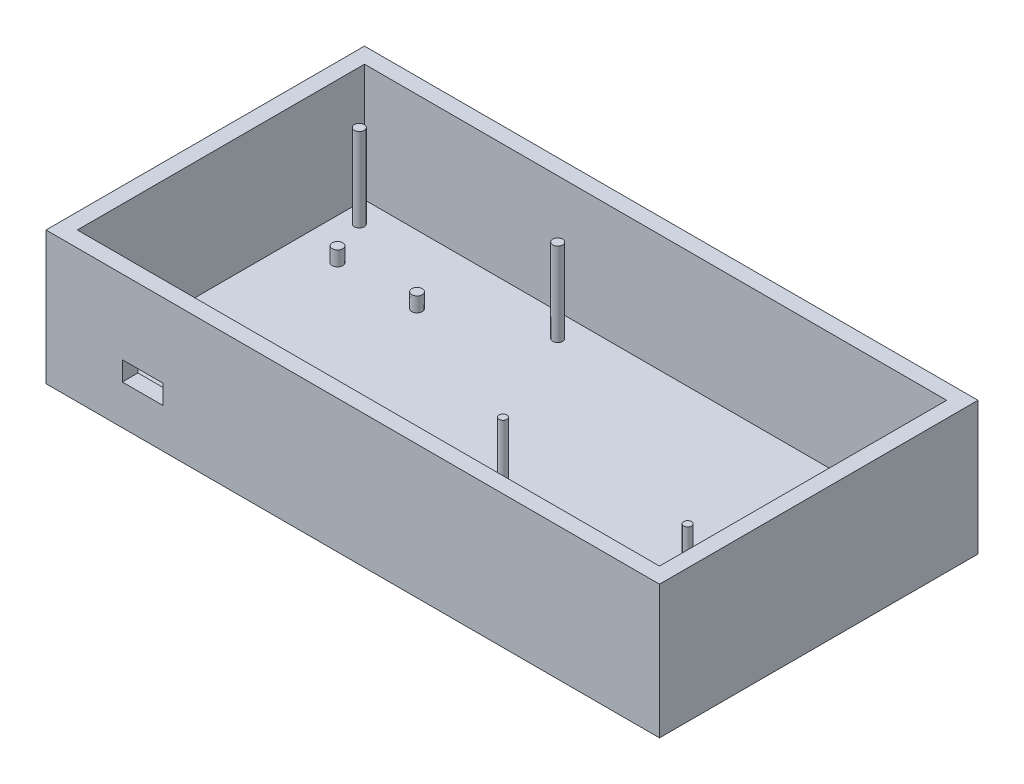
ISO-10303-21;
HEADER;
FILE_DESCRIPTION(('STEP AP214'),'2;1');
FILE_NAME('part.step','',(''),(''),'','','');
FILE_SCHEMA(('AUTOMOTIVE_DESIGN { 1 0 10303 214 1 1 1 1 }'));
ENDSEC;
DATA;
#1=APPLICATION_CONTEXT('core data for automotive mechanical design processes');
#2=APPLICATION_PROTOCOL_DEFINITION('international standard','automotive_design',2000,#1);
#3=PRODUCT_CONTEXT('',#1,'mechanical');
#4=PRODUCT('Part','Part','',(#3));
#5=PRODUCT_RELATED_PRODUCT_CATEGORY('part','',(#4));
#6=PRODUCT_DEFINITION_FORMATION('','',#4);
#7=PRODUCT_DEFINITION_CONTEXT('part definition',#1,'design');
#8=PRODUCT_DEFINITION('design','',#6,#7);
#9=PRODUCT_DEFINITION_SHAPE('','',#8);
#10=(LENGTH_UNIT() NAMED_UNIT(*) SI_UNIT(.MILLI.,.METRE.));
#11=(NAMED_UNIT(*) PLANE_ANGLE_UNIT() SI_UNIT($,.RADIAN.));
#12=(NAMED_UNIT(*) SI_UNIT($,.STERADIAN.) SOLID_ANGLE_UNIT());
#13=UNCERTAINTY_MEASURE_WITH_UNIT(LENGTH_MEASURE(1.E-05),#10,'distance_accuracy_value','');
#14=(GEOMETRIC_REPRESENTATION_CONTEXT(3) GLOBAL_UNCERTAINTY_ASSIGNED_CONTEXT((#13)) GLOBAL_UNIT_ASSIGNED_CONTEXT((#10,
#11,#12)) REPRESENTATION_CONTEXT('',''));
#15=CARTESIAN_POINT('',(0.,0.,0.));
#16=DIRECTION('',(0.,0.,1.));
#17=DIRECTION('',(1.,0.,0.));
#18=AXIS2_PLACEMENT_3D('',#15,#16,#17);
#19=CARTESIAN_POINT('',(-95.3573667152062,22.5,-48.2847726085003));
#20=DIRECTION('',(1.,0.,0.));
#21=DIRECTION('',(0.,0.,-1.));
#22=AXIS2_PLACEMENT_3D('',#19,#20,#21);
#23=PLANE('',#22);
#24=DIRECTION('',(0.,0.,1.));
#25=VECTOR('',#24,1.);
#26=CARTESIAN_POINT('',(-95.3573667152062,-3.,-48.2847726085003));
#27=LINE('',#26,#25);
#28=CARTESIAN_POINT('',(-95.3573667152062,-3.,-51.2847726085003));
#29=VERTEX_POINT('',#28);
#30=CARTESIAN_POINT('',(-95.3573667152062,-3.,9.71522739149973));
#31=VERTEX_POINT('',#30);
#32=EDGE_CURVE('E204',#29,#31,#27,.T.);
#33=ORIENTED_EDGE('',*,*,#32,.T.);
#34=DIRECTION('',(0.,-1.,0.));
#35=VECTOR('',#34,1.);
#36=CARTESIAN_POINT('',(-95.3573667152062,22.5,9.71522739149973));
#37=LINE('',#36,#35);
#38=CARTESIAN_POINT('',(-95.3573667152062,22.5,9.71522739149973));
#39=VERTEX_POINT('',#38);
#40=EDGE_CURVE('E208',#39,#31,#37,.T.);
#41=ORIENTED_EDGE('',*,*,#40,.F.);
#42=DIRECTION('',(0.,0.,1.));
#43=VECTOR('',#42,1.);
#44=CARTESIAN_POINT('',(-95.3573667152062,22.5,-48.2847726085003));
#45=LINE('',#44,#43);
#46=CARTESIAN_POINT('',(-95.3573667152062,22.5,-51.2847726085003));
#47=VERTEX_POINT('',#46);
#48=EDGE_CURVE('E227',#47,#39,#45,.T.);
#49=ORIENTED_EDGE('',*,*,#48,.F.);
#50=DIRECTION('',(0.,-1.,0.));
#51=VECTOR('',#50,1.);
#52=CARTESIAN_POINT('',(-95.3573667152062,22.5,-51.2847726085003));
#53=LINE('',#52,#51);
#54=EDGE_CURVE('E213',#47,#29,#53,.T.);
#55=ORIENTED_EDGE('',*,*,#54,.T.);
#56=EDGE_LOOP('',(#33,#41,#49,#55));
#57=FACE_BOUND('',#56,.T.);
#58=ADVANCED_FACE('F34',(#57),#23,.F.);
#59=CARTESIAN_POINT('',(-92.3573667152062,22.5,9.71522739149973));
#60=DIRECTION('',(0.,0.,-1.));
#61=DIRECTION('',(-1.,0.,0.));
#62=AXIS2_PLACEMENT_3D('',#59,#60,#61);
#63=PLANE('',#62);
#64=DIRECTION('',(1.,0.,0.));
#65=VECTOR('',#64,1.);
#66=CARTESIAN_POINT('',(-80.7473667152062,4.59,9.71522739149973));
#67=LINE('',#66,#65);
#68=CARTESIAN_POINT('',(-80.7473667152062,4.59,9.71522739149973));
#69=VERTEX_POINT('',#68);
#70=CARTESIAN_POINT('',(-72.9473667152062,4.59,9.71522739149973));
#71=VERTEX_POINT('',#70);
#72=EDGE_CURVE('E134',#69,#71,#67,.T.);
#73=ORIENTED_EDGE('',*,*,#72,.F.);
#74=DIRECTION('',(0.,-1.,0.));
#75=VECTOR('',#74,1.);
#76=CARTESIAN_POINT('',(-80.7473667152062,8.29,9.71522739149973));
#77=LINE('',#76,#75);
#78=CARTESIAN_POINT('',(-80.7473667152062,8.29,9.71522739149973));
#79=VERTEX_POINT('',#78);
#80=EDGE_CURVE('E49',#79,#69,#77,.T.);
#81=ORIENTED_EDGE('',*,*,#80,.F.);
#82=DIRECTION('',(-1.,0.,0.));
#83=VECTOR('',#82,1.);
#84=CARTESIAN_POINT('',(-80.7473667152062,8.29,9.71522739149973));
#85=LINE('',#84,#83);
#86=CARTESIAN_POINT('',(-72.9473667152062,8.29,9.71522739149973));
#87=VERTEX_POINT('',#86);
#88=EDGE_CURVE('E141',#87,#79,#85,.T.);
#89=ORIENTED_EDGE('',*,*,#88,.F.);
#90=DIRECTION('',(0.,1.,0.));
#91=VECTOR('',#90,1.);
#92=CARTESIAN_POINT('',(-72.9473667152062,8.29,9.71522739149973));
#93=LINE('',#92,#91);
#94=EDGE_CURVE('E125',#71,#87,#93,.T.);
#95=ORIENTED_EDGE('',*,*,#94,.F.);
#96=EDGE_LOOP('',(#73,#81,#89,#95));
#97=FACE_BOUND('',#96,.T.);
#98=DIRECTION('',(1.,0.,0.));
#99=VECTOR('',#98,1.);
#100=CARTESIAN_POINT('',(-92.3573667152062,-3.,9.71522739149973));
#101=LINE('',#100,#99);
#102=CARTESIAN_POINT('',(22.1426332847938,-3.,9.71522739149973));
#103=VERTEX_POINT('',#102);
#104=EDGE_CURVE('E207',#31,#103,#101,.T.);
#105=ORIENTED_EDGE('',*,*,#104,.T.);
#106=DIRECTION('',(0.,-1.,0.));
#107=VECTOR('',#106,1.);
#108=CARTESIAN_POINT('',(22.1426332847938,22.5,9.71522739149973));
#109=LINE('',#108,#107);
#110=CARTESIAN_POINT('',(22.1426332847938,22.5,9.71522739149973));
#111=VERTEX_POINT('',#110);
#112=EDGE_CURVE('E212',#111,#103,#109,.T.);
#113=ORIENTED_EDGE('',*,*,#112,.F.);
#114=DIRECTION('',(1.,0.,0.));
#115=VECTOR('',#114,1.);
#116=CARTESIAN_POINT('',(-92.3573667152062,22.5,9.71522739149973));
#117=LINE('',#116,#115);
#118=EDGE_CURVE('E230',#39,#111,#117,.T.);
#119=ORIENTED_EDGE('',*,*,#118,.F.);
#120=ORIENTED_EDGE('',*,*,#40,.T.);
#121=EDGE_LOOP('',(#105,#113,#119,#120));
#122=FACE_BOUND('',#121,.T.);
#123=ADVANCED_FACE('F138',(#97,#122),#63,.F.);
#124=CARTESIAN_POINT('',(22.1426332847938,22.5,-48.2847726085003));
#125=DIRECTION('',(-1.,0.,0.));
#126=DIRECTION('',(0.,0.,1.));
#127=AXIS2_PLACEMENT_3D('',#124,#125,#126);
#128=PLANE('',#127);
#129=DIRECTION('',(0.,0.,-1.));
#130=VECTOR('',#129,1.);
#131=CARTESIAN_POINT('',(22.1426332847938,-3.,-48.2847726085003));
#132=LINE('',#131,#130);
#133=CARTESIAN_POINT('',(22.1426332847938,-3.,-51.2847726085003));
#134=VERTEX_POINT('',#133);
#135=EDGE_CURVE('E219',#103,#134,#132,.T.);
#136=ORIENTED_EDGE('',*,*,#135,.T.);
#137=DIRECTION('',(0.,-1.,0.));
#138=VECTOR('',#137,1.);
#139=CARTESIAN_POINT('',(22.1426332847938,22.5,-51.2847726085003));
#140=LINE('',#139,#138);
#141=CARTESIAN_POINT('',(22.1426332847938,22.5,-51.2847726085003));
#142=VERTEX_POINT('',#141);
#143=EDGE_CURVE('E216',#142,#134,#140,.T.);
#144=ORIENTED_EDGE('',*,*,#143,.F.);
#145=DIRECTION('',(0.,0.,-1.));
#146=VECTOR('',#145,1.);
#147=CARTESIAN_POINT('',(22.1426332847938,22.5,-48.2847726085003));
#148=LINE('',#147,#146);
#149=EDGE_CURVE('E232',#111,#142,#148,.T.);
#150=ORIENTED_EDGE('',*,*,#149,.F.);
#151=ORIENTED_EDGE('',*,*,#112,.T.);
#152=EDGE_LOOP('',(#136,#144,#150,#151));
#153=FACE_BOUND('',#152,.T.);
#154=ADVANCED_FACE('F362',(#153),#128,.F.);
#155=CARTESIAN_POINT('',(-92.3573667152062,22.5,-51.2847726085003));
#156=DIRECTION('',(0.,0.,1.));
#157=DIRECTION('',(1.,0.,0.));
#158=AXIS2_PLACEMENT_3D('',#155,#156,#157);
#159=PLANE('',#158);
#160=DIRECTION('',(-1.,0.,0.));
#161=VECTOR('',#160,1.);
#162=CARTESIAN_POINT('',(-92.3573667152062,-3.,-51.2847726085003));
#163=LINE('',#162,#161);
#164=EDGE_CURVE('E223',#134,#29,#163,.T.);
#165=ORIENTED_EDGE('',*,*,#164,.T.);
#166=ORIENTED_EDGE('',*,*,#54,.F.);
#167=DIRECTION('',(-1.,0.,0.));
#168=VECTOR('',#167,1.);
#169=CARTESIAN_POINT('',(-92.3573667152062,22.5,-51.2847726085003));
#170=LINE('',#169,#168);
#171=EDGE_CURVE('E217',#142,#47,#170,.T.);
#172=ORIENTED_EDGE('',*,*,#171,.F.);
#173=ORIENTED_EDGE('',*,*,#143,.T.);
#174=EDGE_LOOP('',(#165,#166,#172,#173));
#175=FACE_BOUND('',#174,.T.);
#176=ADVANCED_FACE('F368',(#175),#159,.F.);
#177=CARTESIAN_POINT('',(0.,22.5,0.));
#178=DIRECTION('',(0.,1.,0.));
#179=DIRECTION('',(0.,0.,1.));
#180=AXIS2_PLACEMENT_3D('',#177,#178,#179);
#181=PLANE('',#180);
#182=DIRECTION('',(0.,0.,1.));
#183=VECTOR('',#182,1.);
#184=CARTESIAN_POINT('',(-92.3573667152062,22.5,-48.2847726085003));
#185=LINE('',#184,#183);
#186=CARTESIAN_POINT('',(-92.3573667152062,22.5,-48.2847726085003));
#187=VERTEX_POINT('',#186);
#188=CARTESIAN_POINT('',(-92.3573667152062,22.5,6.71522739149973));
#189=VERTEX_POINT('',#188);
#190=EDGE_CURVE('E175',#187,#189,#185,.T.);
#191=ORIENTED_EDGE('',*,*,#190,.F.);
#192=DIRECTION('',(-1.,0.,0.));
#193=VECTOR('',#192,1.);
#194=CARTESIAN_POINT('',(-92.3573667152062,22.5,-48.2847726085003));
#195=LINE('',#194,#193);
#196=CARTESIAN_POINT('',(19.1426332847938,22.5,-48.2847726085003));
#197=VERTEX_POINT('',#196);
#198=EDGE_CURVE('E183',#197,#187,#195,.T.);
#199=ORIENTED_EDGE('',*,*,#198,.F.);
#200=DIRECTION('',(0.,0.,-1.));
#201=VECTOR('',#200,1.);
#202=CARTESIAN_POINT('',(19.1426332847938,22.5,-48.2847726085003));
#203=LINE('',#202,#201);
#204=CARTESIAN_POINT('',(19.1426332847938,22.5,6.71522739149973));
#205=VERTEX_POINT('',#204);
#206=EDGE_CURVE('E180',#205,#197,#203,.T.);
#207=ORIENTED_EDGE('',*,*,#206,.F.);
#208=DIRECTION('',(1.,0.,0.));
#209=VECTOR('',#208,1.);
#210=CARTESIAN_POINT('',(-92.3573667152062,22.5,6.71522739149973));
#211=LINE('',#210,#209);
#212=EDGE_CURVE('E177',#189,#205,#211,.T.);
#213=ORIENTED_EDGE('',*,*,#212,.F.);
#214=EDGE_LOOP('',(#191,#199,#207,#213));
#215=FACE_BOUND('',#214,.T.);
#216=ORIENTED_EDGE('',*,*,#48,.T.);
#217=ORIENTED_EDGE('',*,*,#118,.T.);
#218=ORIENTED_EDGE('',*,*,#149,.T.);
#219=ORIENTED_EDGE('',*,*,#171,.T.);
#220=EDGE_LOOP('',(#216,#217,#218,#219));
#221=FACE_BOUND('',#220,.T.);
#222=ADVANCED_FACE('F343',(#215,#221),#181,.T.);
#223=CARTESIAN_POINT('',(0.,-3.,0.));
#224=DIRECTION('',(0.,1.,0.));
#225=DIRECTION('',(0.,0.,1.));
#226=AXIS2_PLACEMENT_3D('',#223,#224,#225);
#227=PLANE('',#226);
#228=ORIENTED_EDGE('',*,*,#32,.F.);
#229=ORIENTED_EDGE('',*,*,#164,.F.);
#230=ORIENTED_EDGE('',*,*,#135,.F.);
#231=ORIENTED_EDGE('',*,*,#104,.F.);
#232=EDGE_LOOP('',(#228,#229,#230,#231));
#233=FACE_BOUND('',#232,.T.);
#234=ADVANCED_FACE('F36',(#233),#227,.F.);
#235=CARTESIAN_POINT('',(-92.3573667152062,22.5,-48.2847726085003));
#236=DIRECTION('',(1.,0.,0.));
#237=DIRECTION('',(0.,0.,-1.));
#238=AXIS2_PLACEMENT_3D('',#235,#236,#237);
#239=PLANE('',#238);
#240=DIRECTION('',(0.,0.,1.));
#241=VECTOR('',#240,1.);
#242=CARTESIAN_POINT('',(-92.3573667152062,0.,-48.2847726085003));
#243=LINE('',#242,#241);
#244=CARTESIAN_POINT('',(-92.3573667152062,0.,-48.2847726085003));
#245=VERTEX_POINT('',#244);
#246=CARTESIAN_POINT('',(-92.3573667152062,0.,6.71522739149973));
#247=VERTEX_POINT('',#246);
#248=EDGE_CURVE('E172',#245,#247,#243,.T.);
#249=ORIENTED_EDGE('',*,*,#248,.F.);
#250=DIRECTION('',(0.,-1.,0.));
#251=VECTOR('',#250,1.);
#252=CARTESIAN_POINT('',(-92.3573667152062,22.5,-48.2847726085003));
#253=LINE('',#252,#251);
#254=EDGE_CURVE('E185',#187,#245,#253,.T.);
#255=ORIENTED_EDGE('',*,*,#254,.F.);
#256=ORIENTED_EDGE('',*,*,#190,.T.);
#257=DIRECTION('',(0.,-1.,0.));
#258=VECTOR('',#257,1.);
#259=CARTESIAN_POINT('',(-92.3573667152062,22.5,6.71522739149973));
#260=LINE('',#259,#258);
#261=EDGE_CURVE('E201',#189,#247,#260,.T.);
#262=ORIENTED_EDGE('',*,*,#261,.T.);
#263=EDGE_LOOP('',(#249,#255,#256,#262));
#264=FACE_BOUND('',#263,.T.);
#265=ADVANCED_FACE('F336',(#264),#239,.T.);
#266=CARTESIAN_POINT('',(-92.3573667152062,22.5,6.71522739149973));
#267=DIRECTION('',(0.,0.,-1.));
#268=DIRECTION('',(-1.,0.,0.));
#269=AXIS2_PLACEMENT_3D('',#266,#267,#268);
#270=PLANE('',#269);
#271=DIRECTION('',(0.,1.,0.));
#272=VECTOR('',#271,1.);
#273=CARTESIAN_POINT('',(-80.7473667152062,22.5,6.71522739149973));
#274=LINE('',#273,#272);
#275=CARTESIAN_POINT('',(-80.7473667152062,4.59,6.71522739149973));
#276=VERTEX_POINT('',#275);
#277=CARTESIAN_POINT('',(-80.7473667152062,8.29,6.71522739149973));
#278=VERTEX_POINT('',#277);
#279=EDGE_CURVE('E11',#276,#278,#274,.T.);
#280=ORIENTED_EDGE('',*,*,#279,.F.);
#281=DIRECTION('',(-1.,0.,0.));
#282=VECTOR('',#281,1.);
#283=CARTESIAN_POINT('',(-92.3573667152062,4.59,6.71522739149973));
#284=LINE('',#283,#282);
#285=CARTESIAN_POINT('',(-72.9473667152062,4.59,6.71522739149973));
#286=VERTEX_POINT('',#285);
#287=EDGE_CURVE('E211',#286,#276,#284,.T.);
#288=ORIENTED_EDGE('',*,*,#287,.F.);
#289=DIRECTION('',(0.,-1.,0.));
#290=VECTOR('',#289,1.);
#291=CARTESIAN_POINT('',(-72.9473667152062,22.5,6.71522739149973));
#292=LINE('',#291,#290);
#293=CARTESIAN_POINT('',(-72.9473667152062,8.29,6.71522739149973));
#294=VERTEX_POINT('',#293);
#295=EDGE_CURVE('E128',#294,#286,#292,.T.);
#296=ORIENTED_EDGE('',*,*,#295,.F.);
#297=DIRECTION('',(1.,0.,0.));
#298=VECTOR('',#297,1.);
#299=CARTESIAN_POINT('',(-92.3573667152062,8.29,6.71522739149973));
#300=LINE('',#299,#298);
#301=EDGE_CURVE('E42',#278,#294,#300,.T.);
#302=ORIENTED_EDGE('',*,*,#301,.F.);
#303=EDGE_LOOP('',(#280,#288,#296,#302));
#304=FACE_BOUND('',#303,.T.);
#305=DIRECTION('',(1.,0.,0.));
#306=VECTOR('',#305,1.);
#307=CARTESIAN_POINT('',(-92.3573667152062,0.,6.71522739149973));
#308=LINE('',#307,#306);
#309=CARTESIAN_POINT('',(19.1426332847938,0.,6.71522739149973));
#310=VERTEX_POINT('',#309);
#311=EDGE_CURVE('E188',#247,#310,#308,.T.);
#312=ORIENTED_EDGE('',*,*,#311,.F.);
#313=ORIENTED_EDGE('',*,*,#261,.F.);
#314=ORIENTED_EDGE('',*,*,#212,.T.);
#315=DIRECTION('',(0.,-1.,0.));
#316=VECTOR('',#315,1.);
#317=CARTESIAN_POINT('',(19.1426332847938,22.5,6.71522739149973));
#318=LINE('',#317,#316);
#319=EDGE_CURVE('E198',#205,#310,#318,.T.);
#320=ORIENTED_EDGE('',*,*,#319,.T.);
#321=EDGE_LOOP('',(#312,#313,#314,#320));
#322=FACE_BOUND('',#321,.T.);
#323=ADVANCED_FACE('F242',(#304,#322),#270,.T.);
#324=CARTESIAN_POINT('',(19.1426332847938,22.5,-48.2847726085003));
#325=DIRECTION('',(-1.,0.,0.));
#326=DIRECTION('',(0.,0.,1.));
#327=AXIS2_PLACEMENT_3D('',#324,#325,#326);
#328=PLANE('',#327);
#329=DIRECTION('',(0.,0.,-1.));
#330=VECTOR('',#329,1.);
#331=CARTESIAN_POINT('',(19.1426332847938,0.,-48.2847726085003));
#332=LINE('',#331,#330);
#333=CARTESIAN_POINT('',(19.1426332847938,0.,-48.2847726085003));
#334=VERTEX_POINT('',#333);
#335=EDGE_CURVE('E190',#310,#334,#332,.T.);
#336=ORIENTED_EDGE('',*,*,#335,.F.);
#337=ORIENTED_EDGE('',*,*,#319,.F.);
#338=ORIENTED_EDGE('',*,*,#206,.T.);
#339=DIRECTION('',(0.,-1.,0.));
#340=VECTOR('',#339,1.);
#341=CARTESIAN_POINT('',(19.1426332847938,22.5,-48.2847726085003));
#342=LINE('',#341,#340);
#343=EDGE_CURVE('E195',#197,#334,#342,.T.);
#344=ORIENTED_EDGE('',*,*,#343,.T.);
#345=EDGE_LOOP('',(#336,#337,#338,#344));
#346=FACE_BOUND('',#345,.T.);
#347=ADVANCED_FACE('F348',(#346),#328,.T.);
#348=CARTESIAN_POINT('',(-92.3573667152062,22.5,-48.2847726085003));
#349=DIRECTION('',(0.,0.,1.));
#350=DIRECTION('',(1.,0.,0.));
#351=AXIS2_PLACEMENT_3D('',#348,#349,#350);
#352=PLANE('',#351);
#353=DIRECTION('',(-1.,0.,0.));
#354=VECTOR('',#353,1.);
#355=CARTESIAN_POINT('',(-92.3573667152062,0.,-48.2847726085003));
#356=LINE('',#355,#354);
#357=EDGE_CURVE('E178',#334,#245,#356,.T.);
#358=ORIENTED_EDGE('',*,*,#357,.F.);
#359=ORIENTED_EDGE('',*,*,#343,.F.);
#360=ORIENTED_EDGE('',*,*,#198,.T.);
#361=ORIENTED_EDGE('',*,*,#254,.T.);
#362=EDGE_LOOP('',(#358,#359,#360,#361));
#363=FACE_BOUND('',#362,.T.);
#364=ADVANCED_FACE('F308',(#363),#352,.T.);
#365=CARTESIAN_POINT('',(0.,0.,0.));
#366=DIRECTION('',(0.,1.,0.));
#367=DIRECTION('',(0.,0.,1.));
#368=AXIS2_PLACEMENT_3D('',#365,#366,#367);
#369=PLANE('',#368);
#370=CARTESIAN_POINT('',(-30.4473667152062,0.,4.41522739149973));
#371=DIRECTION('',(0.,1.,0.));
#372=DIRECTION('',(0.,0.,1.));
#373=AXIS2_PLACEMENT_3D('',#370,#371,#372);
#374=CIRCLE('',#373,0.740000000000002);
#375=CARTESIAN_POINT('',(-30.4473667152062,0.,5.15522739149973));
#376=VERTEX_POINT('',#375);
#377=EDGE_CURVE('E289',#376,#376,#374,.T.);
#378=ORIENTED_EDGE('',*,*,#377,.F.);
#379=EDGE_LOOP('',(#378));
#380=FACE_BOUND('',#379,.T.);
#381=CARTESIAN_POINT('',(4.91263328479381,0.,4.41522739149973));
#382=DIRECTION('',(0.,1.,0.));
#383=DIRECTION('',(0.,0.,1.));
#384=AXIS2_PLACEMENT_3D('',#381,#382,#383);
#385=CIRCLE('',#384,0.74);
#386=CARTESIAN_POINT('',(4.91263328479381,0.,5.15522739149973));
#387=VERTEX_POINT('',#386);
#388=EDGE_CURVE('E283',#387,#387,#385,.T.);
#389=ORIENTED_EDGE('',*,*,#388,.F.);
#390=EDGE_LOOP('',(#389));
#391=FACE_BOUND('',#390,.T.);
#392=CARTESIAN_POINT('',(4.91263328479381,0.,-12.8947726085003));
#393=DIRECTION('',(0.,1.,0.));
#394=DIRECTION('',(0.,0.,1.));
#395=AXIS2_PLACEMENT_3D('',#392,#393,#394);
#396=CIRCLE('',#395,0.74);
#397=CARTESIAN_POINT('',(4.91263328479381,0.,-12.1547726085003));
#398=VERTEX_POINT('',#397);
#399=EDGE_CURVE('E277',#398,#398,#396,.T.);
#400=ORIENTED_EDGE('',*,*,#399,.F.);
#401=EDGE_LOOP('',(#400));
#402=FACE_BOUND('',#401,.T.);
#403=CARTESIAN_POINT('',(-30.4473667152062,0.,-12.8947726085003));
#404=DIRECTION('',(0.,1.,0.));
#405=DIRECTION('',(0.,0.,1.));
#406=AXIS2_PLACEMENT_3D('',#403,#404,#405);
#407=CIRCLE('',#406,0.740000000000002);
#408=CARTESIAN_POINT('',(-30.4473667152062,0.,-12.1547726085003));
#409=VERTEX_POINT('',#408);
#410=EDGE_CURVE('E271',#409,#409,#407,.T.);
#411=ORIENTED_EDGE('',*,*,#410,.F.);
#412=EDGE_LOOP('',(#411));
#413=FACE_BOUND('',#412,.T.);
#414=CARTESIAN_POINT('',(-84.5176075825087,0.,5.36788827556464));
#415=DIRECTION('',(0.,1.,0.));
#416=DIRECTION('',(0.,0.,1.));
#417=AXIS2_PLACEMENT_3D('',#414,#415,#416);
#418=CIRCLE('',#417,0.999999999999998);
#419=CARTESIAN_POINT('',(-84.5176075825087,0.,6.36788827556464));
#420=VERTEX_POINT('',#419);
#421=EDGE_CURVE('E265',#420,#420,#418,.T.);
#422=ORIENTED_EDGE('',*,*,#421,.F.);
#423=EDGE_LOOP('',(#422));
#424=FACE_BOUND('',#423,.T.);
#425=CARTESIAN_POINT('',(-69.2776075825087,0.,5.36788827556461));
#426=DIRECTION('',(0.,1.,0.));
#427=DIRECTION('',(0.,0.,1.));
#428=AXIS2_PLACEMENT_3D('',#425,#426,#427);
#429=CIRCLE('',#428,0.999999999999998);
#430=CARTESIAN_POINT('',(-69.2776075825087,0.,6.36788827556461));
#431=VERTEX_POINT('',#430);
#432=EDGE_CURVE('E259',#431,#431,#429,.T.);
#433=ORIENTED_EDGE('',*,*,#432,.F.);
#434=EDGE_LOOP('',(#433));
#435=FACE_BOUND('',#434,.T.);
#436=CARTESIAN_POINT('',(-69.2776075825088,0.,-35.2721117244354));
#437=DIRECTION('',(0.,1.,0.));
#438=DIRECTION('',(0.,0.,1.));
#439=AXIS2_PLACEMENT_3D('',#436,#437,#438);
#440=CIRCLE('',#439,0.999999999999998);
#441=CARTESIAN_POINT('',(-69.2776075825088,0.,-34.2721117244354));
#442=VERTEX_POINT('',#441);
#443=EDGE_CURVE('E253',#442,#442,#440,.T.);
#444=ORIENTED_EDGE('',*,*,#443,.F.);
#445=EDGE_LOOP('',(#444));
#446=FACE_BOUND('',#445,.T.);
#447=CARTESIAN_POINT('',(-84.5176075825088,0.,-35.2721117244354));
#448=DIRECTION('',(0.,1.,0.));
#449=DIRECTION('',(0.,0.,1.));
#450=AXIS2_PLACEMENT_3D('',#447,#448,#449);
#451=CIRCLE('',#450,0.999999999999998);
#452=CARTESIAN_POINT('',(-84.5176075825088,0.,-34.2721117244354));
#453=VERTEX_POINT('',#452);
#454=EDGE_CURVE('E247',#453,#453,#451,.T.);
#455=ORIENTED_EDGE('',*,*,#454,.F.);
#456=EDGE_LOOP('',(#455));
#457=FACE_BOUND('',#456,.T.);
#458=CARTESIAN_POINT('',(-50.8573667152062,0.,2.21522739149973));
#459=DIRECTION('',(0.,1.,0.));
#460=DIRECTION('',(0.,0.,1.));
#461=AXIS2_PLACEMENT_3D('',#458,#459,#460);
#462=CIRCLE('',#461,0.950000000000001);
#463=CARTESIAN_POINT('',(-50.8573667152062,0.,3.16522739149973));
#464=VERTEX_POINT('',#463);
#465=EDGE_CURVE('E148',#464,#464,#462,.T.);
#466=ORIENTED_EDGE('',*,*,#465,.F.);
#467=EDGE_LOOP('',(#466));
#468=FACE_BOUND('',#467,.T.);
#469=CARTESIAN_POINT('',(-88.8573667152062,0.,2.21522739149973));
#470=DIRECTION('',(0.,1.,0.));
#471=DIRECTION('',(0.,0.,1.));
#472=AXIS2_PLACEMENT_3D('',#469,#470,#471);
#473=CIRCLE('',#472,0.950000000000002);
#474=CARTESIAN_POINT('',(-88.8573667152062,0.,3.16522739149973));
#475=VERTEX_POINT('',#474);
#476=EDGE_CURVE('E154',#475,#475,#473,.T.);
#477=ORIENTED_EDGE('',*,*,#476,.F.);
#478=EDGE_LOOP('',(#477));
#479=FACE_BOUND('',#478,.T.);
#480=CARTESIAN_POINT('',(-88.8573667152062,0.,-43.7847726085003));
#481=DIRECTION('',(0.,1.,0.));
#482=DIRECTION('',(0.,0.,1.));
#483=AXIS2_PLACEMENT_3D('',#480,#481,#482);
#484=CIRCLE('',#483,0.950000000000001);
#485=CARTESIAN_POINT('',(-88.8573667152062,0.,-42.8347726085003));
#486=VERTEX_POINT('',#485);
#487=EDGE_CURVE('E160',#486,#486,#484,.T.);
#488=ORIENTED_EDGE('',*,*,#487,.F.);
#489=EDGE_LOOP('',(#488));
#490=FACE_BOUND('',#489,.T.);
#491=CARTESIAN_POINT('',(-50.8573667152062,0.,-43.7847726085003));
#492=DIRECTION('',(0.,1.,0.));
#493=DIRECTION('',(0.,0.,1.));
#494=AXIS2_PLACEMENT_3D('',#491,#492,#493);
#495=CIRCLE('',#494,0.950000000000001);
#496=CARTESIAN_POINT('',(-50.8573667152062,0.,-42.8347726085003));
#497=VERTEX_POINT('',#496);
#498=EDGE_CURVE('E166',#497,#497,#495,.T.);
#499=ORIENTED_EDGE('',*,*,#498,.F.);
#500=EDGE_LOOP('',(#499));
#501=FACE_BOUND('',#500,.T.);
#502=ORIENTED_EDGE('',*,*,#248,.T.);
#503=ORIENTED_EDGE('',*,*,#311,.T.);
#504=ORIENTED_EDGE('',*,*,#335,.T.);
#505=ORIENTED_EDGE('',*,*,#357,.T.);
#506=EDGE_LOOP('',(#502,#503,#504,#505));
#507=FACE_BOUND('',#506,.T.);
#508=ADVANCED_FACE('F304',(#380,#391,#402,#413,#424,#435,#446,#457,#468,#479,#490,#501,#507),
#369,.T.);
#509=CARTESIAN_POINT('',(-50.8573667152062,16.,-43.7847726085003));
#510=DIRECTION('',(0.,-1.,0.));
#511=DIRECTION('',(0.,0.,-1.));
#512=AXIS2_PLACEMENT_3D('',#509,#510,#511);
#513=CYLINDRICAL_SURFACE('',#512,0.950000000000001);
#514=CARTESIAN_POINT('',(-50.8573667152062,16.,-43.7847726085003));
#515=DIRECTION('',(0.,1.,0.));
#516=DIRECTION('',(0.,0.,1.));
#517=AXIS2_PLACEMENT_3D('',#514,#515,#516);
#518=CIRCLE('',#517,0.950000000000001);
#519=CARTESIAN_POINT('',(-50.8573667152062,16.,-42.8347726085003));
#520=VERTEX_POINT('',#519);
#521=EDGE_CURVE('E169',#520,#520,#518,.T.);
#522=ORIENTED_EDGE('',*,*,#521,.F.);
#523=EDGE_LOOP('',(#522));
#524=FACE_BOUND('',#523,.T.);
#525=ORIENTED_EDGE('',*,*,#498,.T.);
#526=EDGE_LOOP('',(#525));
#527=FACE_BOUND('',#526,.T.);
#528=ADVANCED_FACE('F307',(#524,#527),#513,.T.);
#529=CARTESIAN_POINT('',(0.,16.,0.));
#530=DIRECTION('',(0.,1.,0.));
#531=DIRECTION('',(0.,0.,1.));
#532=AXIS2_PLACEMENT_3D('',#529,#530,#531);
#533=PLANE('',#532);
#534=ORIENTED_EDGE('',*,*,#521,.T.);
#535=EDGE_LOOP('',(#534));
#536=FACE_BOUND('',#535,.T.);
#537=ADVANCED_FACE('F418',(#536),#533,.T.);
#538=CARTESIAN_POINT('',(-88.8573667152062,16.,-43.7847726085003));
#539=DIRECTION('',(0.,-1.,0.));
#540=DIRECTION('',(0.,0.,-1.));
#541=AXIS2_PLACEMENT_3D('',#538,#539,#540);
#542=CYLINDRICAL_SURFACE('',#541,0.950000000000001);
#543=CARTESIAN_POINT('',(-88.8573667152062,16.,-43.7847726085003));
#544=DIRECTION('',(0.,1.,0.));
#545=DIRECTION('',(0.,0.,1.));
#546=AXIS2_PLACEMENT_3D('',#543,#544,#545);
#547=CIRCLE('',#546,0.950000000000001);
#548=CARTESIAN_POINT('',(-88.8573667152062,16.,-42.8347726085003));
#549=VERTEX_POINT('',#548);
#550=EDGE_CURVE('E163',#549,#549,#547,.T.);
#551=ORIENTED_EDGE('',*,*,#550,.F.);
#552=EDGE_LOOP('',(#551));
#553=FACE_BOUND('',#552,.T.);
#554=ORIENTED_EDGE('',*,*,#487,.T.);
#555=EDGE_LOOP('',(#554));
#556=FACE_BOUND('',#555,.T.);
#557=ADVANCED_FACE('F429',(#553,#556),#542,.T.);
#558=CARTESIAN_POINT('',(0.,16.,0.));
#559=DIRECTION('',(0.,1.,0.));
#560=DIRECTION('',(0.,0.,1.));
#561=AXIS2_PLACEMENT_3D('',#558,#559,#560);
#562=PLANE('',#561);
#563=ORIENTED_EDGE('',*,*,#550,.T.);
#564=EDGE_LOOP('',(#563));
#565=FACE_BOUND('',#564,.T.);
#566=ADVANCED_FACE('F439',(#565),#562,.T.);
#567=CARTESIAN_POINT('',(-88.8573667152062,16.,2.21522739149973));
#568=DIRECTION('',(0.,-1.,0.));
#569=DIRECTION('',(0.,0.,-1.));
#570=AXIS2_PLACEMENT_3D('',#567,#568,#569);
#571=CYLINDRICAL_SURFACE('',#570,0.950000000000002);
#572=CARTESIAN_POINT('',(-88.8573667152062,16.,2.21522739149973));
#573=DIRECTION('',(0.,1.,0.));
#574=DIRECTION('',(0.,0.,1.));
#575=AXIS2_PLACEMENT_3D('',#572,#573,#574);
#576=CIRCLE('',#575,0.950000000000002);
#577=CARTESIAN_POINT('',(-88.8573667152062,16.,3.16522739149973));
#578=VERTEX_POINT('',#577);
#579=EDGE_CURVE('E157',#578,#578,#576,.T.);
#580=ORIENTED_EDGE('',*,*,#579,.F.);
#581=EDGE_LOOP('',(#580));
#582=FACE_BOUND('',#581,.T.);
#583=ORIENTED_EDGE('',*,*,#476,.T.);
#584=EDGE_LOOP('',(#583));
#585=FACE_BOUND('',#584,.T.);
#586=ADVANCED_FACE('F449',(#582,#585),#571,.T.);
#587=CARTESIAN_POINT('',(0.,16.,0.));
#588=DIRECTION('',(0.,1.,0.));
#589=DIRECTION('',(0.,0.,1.));
#590=AXIS2_PLACEMENT_3D('',#587,#588,#589);
#591=PLANE('',#590);
#592=ORIENTED_EDGE('',*,*,#579,.T.);
#593=EDGE_LOOP('',(#592));
#594=FACE_BOUND('',#593,.T.);
#595=ADVANCED_FACE('F459',(#594),#591,.T.);
#596=CARTESIAN_POINT('',(-50.8573667152062,16.,2.21522739149973));
#597=DIRECTION('',(0.,-1.,0.));
#598=DIRECTION('',(0.,0.,-1.));
#599=AXIS2_PLACEMENT_3D('',#596,#597,#598);
#600=CYLINDRICAL_SURFACE('',#599,0.950000000000001);
#601=CARTESIAN_POINT('',(-50.8573667152062,16.,2.21522739149973));
#602=DIRECTION('',(0.,1.,0.));
#603=DIRECTION('',(0.,0.,1.));
#604=AXIS2_PLACEMENT_3D('',#601,#602,#603);
#605=CIRCLE('',#604,0.950000000000001);
#606=CARTESIAN_POINT('',(-50.8573667152062,16.,3.16522739149973));
#607=VERTEX_POINT('',#606);
#608=EDGE_CURVE('E151',#607,#607,#605,.T.);
#609=ORIENTED_EDGE('',*,*,#608,.F.);
#610=EDGE_LOOP('',(#609));
#611=FACE_BOUND('',#610,.T.);
#612=ORIENTED_EDGE('',*,*,#465,.T.);
#613=EDGE_LOOP('',(#612));
#614=FACE_BOUND('',#613,.T.);
#615=ADVANCED_FACE('F469',(#611,#614),#600,.T.);
#616=CARTESIAN_POINT('',(0.,16.,0.));
#617=DIRECTION('',(0.,1.,0.));
#618=DIRECTION('',(0.,0.,1.));
#619=AXIS2_PLACEMENT_3D('',#616,#617,#618);
#620=PLANE('',#619);
#621=ORIENTED_EDGE('',*,*,#608,.T.);
#622=EDGE_LOOP('',(#621));
#623=FACE_BOUND('',#622,.T.);
#624=ADVANCED_FACE('F479',(#623),#620,.T.);
#625=CARTESIAN_POINT('',(-80.7473667152062,8.29,5.81522739149973));
#626=DIRECTION('',(-1.,0.,0.));
#627=DIRECTION('',(0.,0.,1.));
#628=AXIS2_PLACEMENT_3D('',#625,#626,#627);
#629=PLANE('',#628);
#630=ORIENTED_EDGE('',*,*,#279,.T.);
#631=DIRECTION('',(0.,0.,1.));
#632=VECTOR('',#631,1.);
#633=CARTESIAN_POINT('',(-80.7473667152062,8.29,5.81522739149973));
#634=LINE('',#633,#632);
#635=EDGE_CURVE('E146',#278,#79,#634,.T.);
#636=ORIENTED_EDGE('',*,*,#635,.T.);
#637=ORIENTED_EDGE('',*,*,#80,.T.);
#638=DIRECTION('',(0.,0.,1.));
#639=VECTOR('',#638,1.);
#640=CARTESIAN_POINT('',(-80.7473667152062,4.59,5.81522739149973));
#641=LINE('',#640,#639);
#642=EDGE_CURVE('E131',#276,#69,#641,.T.);
#643=ORIENTED_EDGE('',*,*,#642,.F.);
#644=EDGE_LOOP('',(#630,#636,#637,#643));
#645=FACE_BOUND('',#644,.T.);
#646=ADVANCED_FACE('F244',(#645),#629,.F.);
#647=CARTESIAN_POINT('',(-80.7473667152062,8.29,5.81522739149973));
#648=DIRECTION('',(0.,1.,0.));
#649=DIRECTION('',(0.,0.,1.));
#650=AXIS2_PLACEMENT_3D('',#647,#648,#649);
#651=PLANE('',#650);
#652=ORIENTED_EDGE('',*,*,#301,.T.);
#653=DIRECTION('',(0.,0.,1.));
#654=VECTOR('',#653,1.);
#655=CARTESIAN_POINT('',(-72.9473667152062,8.29,5.81522739149973));
#656=LINE('',#655,#654);
#657=EDGE_CURVE('E130',#294,#87,#656,.T.);
#658=ORIENTED_EDGE('',*,*,#657,.T.);
#659=ORIENTED_EDGE('',*,*,#88,.T.);
#660=ORIENTED_EDGE('',*,*,#635,.F.);
#661=EDGE_LOOP('',(#652,#658,#659,#660));
#662=FACE_BOUND('',#661,.T.);
#663=ADVANCED_FACE('F239',(#662),#651,.F.);
#664=CARTESIAN_POINT('',(-72.9473667152062,8.29,5.81522739149973));
#665=DIRECTION('',(1.,0.,0.));
#666=DIRECTION('',(0.,0.,-1.));
#667=AXIS2_PLACEMENT_3D('',#664,#665,#666);
#668=PLANE('',#667);
#669=ORIENTED_EDGE('',*,*,#295,.T.);
#670=DIRECTION('',(0.,0.,1.));
#671=VECTOR('',#670,1.);
#672=CARTESIAN_POINT('',(-72.9473667152062,4.59,5.81522739149973));
#673=LINE('',#672,#671);
#674=EDGE_CURVE('E57',#286,#71,#673,.T.);
#675=ORIENTED_EDGE('',*,*,#674,.T.);
#676=ORIENTED_EDGE('',*,*,#94,.T.);
#677=ORIENTED_EDGE('',*,*,#657,.F.);
#678=EDGE_LOOP('',(#669,#675,#676,#677));
#679=FACE_BOUND('',#678,.T.);
#680=ADVANCED_FACE('F122',(#679),#668,.F.);
#681=CARTESIAN_POINT('',(-80.7473667152062,4.59,5.81522739149973));
#682=DIRECTION('',(0.,-1.,0.));
#683=DIRECTION('',(0.,0.,-1.));
#684=AXIS2_PLACEMENT_3D('',#681,#682,#683);
#685=PLANE('',#684);
#686=ORIENTED_EDGE('',*,*,#287,.T.);
#687=ORIENTED_EDGE('',*,*,#642,.T.);
#688=ORIENTED_EDGE('',*,*,#72,.T.);
#689=ORIENTED_EDGE('',*,*,#674,.F.);
#690=EDGE_LOOP('',(#686,#687,#688,#689));
#691=FACE_BOUND('',#690,.T.);
#692=ADVANCED_FACE('F135',(#691),#685,.F.);
#693=CARTESIAN_POINT('',(-84.5176075825088,2.81,-35.2721117244354));
#694=DIRECTION('',(0.,-1.,0.));
#695=DIRECTION('',(0.,0.,-1.));
#696=AXIS2_PLACEMENT_3D('',#693,#694,#695);
#697=CYLINDRICAL_SURFACE('',#696,0.999999999999998);
#698=CARTESIAN_POINT('',(-84.5176075825088,2.81,-35.2721117244354));
#699=DIRECTION('',(0.,1.,0.));
#700=DIRECTION('',(0.,0.,1.));
#701=AXIS2_PLACEMENT_3D('',#698,#699,#700);
#702=CIRCLE('',#701,0.999999999999998);
#703=CARTESIAN_POINT('',(-84.5176075825088,2.81,-34.2721117244354));
#704=VERTEX_POINT('',#703);
#705=EDGE_CURVE('E245',#704,#704,#702,.T.);
#706=ORIENTED_EDGE('',*,*,#705,.F.);
#707=EDGE_LOOP('',(#706));
#708=FACE_BOUND('',#707,.T.);
#709=ORIENTED_EDGE('',*,*,#454,.T.);
#710=EDGE_LOOP('',(#709));
#711=FACE_BOUND('',#710,.T.);
#712=ADVANCED_FACE('F637',(#708,#711),#697,.T.);
#713=CARTESIAN_POINT('',(0.,2.81,0.));
#714=DIRECTION('',(0.,1.,0.));
#715=DIRECTION('',(0.,0.,1.));
#716=AXIS2_PLACEMENT_3D('',#713,#714,#715);
#717=PLANE('',#716);
#718=ORIENTED_EDGE('',*,*,#705,.T.);
#719=EDGE_LOOP('',(#718));
#720=FACE_BOUND('',#719,.T.);
#721=ADVANCED_FACE('F633',(#720),#717,.T.);
#722=CARTESIAN_POINT('',(-69.2776075825088,2.81,-35.2721117244354));
#723=DIRECTION('',(0.,-1.,0.));
#724=DIRECTION('',(0.,0.,-1.));
#725=AXIS2_PLACEMENT_3D('',#722,#723,#724);
#726=CYLINDRICAL_SURFACE('',#725,0.999999999999998);
#727=CARTESIAN_POINT('',(-69.2776075825088,2.81,-35.2721117244354));
#728=DIRECTION('',(0.,1.,0.));
#729=DIRECTION('',(0.,0.,1.));
#730=AXIS2_PLACEMENT_3D('',#727,#728,#729);
#731=CIRCLE('',#730,0.999999999999998);
#732=CARTESIAN_POINT('',(-69.2776075825088,2.81,-34.2721117244354));
#733=VERTEX_POINT('',#732);
#734=EDGE_CURVE('E251',#733,#733,#731,.T.);
#735=ORIENTED_EDGE('',*,*,#734,.F.);
#736=EDGE_LOOP('',(#735));
#737=FACE_BOUND('',#736,.T.);
#738=ORIENTED_EDGE('',*,*,#443,.T.);
#739=EDGE_LOOP('',(#738));
#740=FACE_BOUND('',#739,.T.);
#741=ADVANCED_FACE('F629',(#737,#740),#726,.T.);
#742=CARTESIAN_POINT('',(0.,2.81,0.));
#743=DIRECTION('',(0.,1.,0.));
#744=DIRECTION('',(0.,0.,1.));
#745=AXIS2_PLACEMENT_3D('',#742,#743,#744);
#746=PLANE('',#745);
#747=ORIENTED_EDGE('',*,*,#734,.T.);
#748=EDGE_LOOP('',(#747));
#749=FACE_BOUND('',#748,.T.);
#750=ADVANCED_FACE('F625',(#749),#746,.T.);
#751=CARTESIAN_POINT('',(-69.2776075825087,2.81,5.36788827556461));
#752=DIRECTION('',(0.,-1.,0.));
#753=DIRECTION('',(0.,0.,-1.));
#754=AXIS2_PLACEMENT_3D('',#751,#752,#753);
#755=CYLINDRICAL_SURFACE('',#754,0.999999999999998);
#756=CARTESIAN_POINT('',(-69.2776075825087,2.81,5.36788827556461));
#757=DIRECTION('',(0.,1.,0.));
#758=DIRECTION('',(0.,0.,1.));
#759=AXIS2_PLACEMENT_3D('',#756,#757,#758);
#760=CIRCLE('',#759,0.999999999999998);
#761=CARTESIAN_POINT('',(-69.2776075825087,2.81,6.36788827556461));
#762=VERTEX_POINT('',#761);
#763=EDGE_CURVE('E256',#762,#762,#760,.T.);
#764=ORIENTED_EDGE('',*,*,#763,.F.);
#765=EDGE_LOOP('',(#764));
#766=FACE_BOUND('',#765,.T.);
#767=ORIENTED_EDGE('',*,*,#432,.T.);
#768=EDGE_LOOP('',(#767));
#769=FACE_BOUND('',#768,.T.);
#770=ADVANCED_FACE('F621',(#766,#769),#755,.T.);
#771=CARTESIAN_POINT('',(0.,2.81,0.));
#772=DIRECTION('',(0.,1.,0.));
#773=DIRECTION('',(0.,0.,1.));
#774=AXIS2_PLACEMENT_3D('',#771,#772,#773);
#775=PLANE('',#774);
#776=ORIENTED_EDGE('',*,*,#763,.T.);
#777=EDGE_LOOP('',(#776));
#778=FACE_BOUND('',#777,.T.);
#779=ADVANCED_FACE('F617',(#778),#775,.T.);
#780=CARTESIAN_POINT('',(-84.5176075825087,2.81,5.36788827556464));
#781=DIRECTION('',(0.,-1.,0.));
#782=DIRECTION('',(0.,0.,-1.));
#783=AXIS2_PLACEMENT_3D('',#780,#781,#782);
#784=CYLINDRICAL_SURFACE('',#783,0.999999999999998);
#785=CARTESIAN_POINT('',(-84.5176075825087,2.81,5.36788827556464));
#786=DIRECTION('',(0.,1.,0.));
#787=DIRECTION('',(0.,0.,1.));
#788=AXIS2_PLACEMENT_3D('',#785,#786,#787);
#789=CIRCLE('',#788,0.999999999999998);
#790=CARTESIAN_POINT('',(-84.5176075825087,2.81,6.36788827556464));
#791=VERTEX_POINT('',#790);
#792=EDGE_CURVE('E262',#791,#791,#789,.T.);
#793=ORIENTED_EDGE('',*,*,#792,.F.);
#794=EDGE_LOOP('',(#793));
#795=FACE_BOUND('',#794,.T.);
#796=ORIENTED_EDGE('',*,*,#421,.T.);
#797=EDGE_LOOP('',(#796));
#798=FACE_BOUND('',#797,.T.);
#799=ADVANCED_FACE('F613',(#795,#798),#784,.T.);
#800=CARTESIAN_POINT('',(0.,2.81,0.));
#801=DIRECTION('',(0.,1.,0.));
#802=DIRECTION('',(0.,0.,1.));
#803=AXIS2_PLACEMENT_3D('',#800,#801,#802);
#804=PLANE('',#803);
#805=ORIENTED_EDGE('',*,*,#792,.T.);
#806=EDGE_LOOP('',(#805));
#807=FACE_BOUND('',#806,.T.);
#808=ADVANCED_FACE('F534',(#807),#804,.T.);
#809=CARTESIAN_POINT('',(-30.4473667152062,12.6,-12.8947726085003));
#810=DIRECTION('',(0.,-1.,0.));
#811=DIRECTION('',(0.,0.,-1.));
#812=AXIS2_PLACEMENT_3D('',#809,#810,#811);
#813=CYLINDRICAL_SURFACE('',#812,0.740000000000002);
#814=CARTESIAN_POINT('',(-30.4473667152062,12.6,-12.8947726085003));
#815=DIRECTION('',(0.,1.,0.));
#816=DIRECTION('',(0.,0.,1.));
#817=AXIS2_PLACEMENT_3D('',#814,#815,#816);
#818=CIRCLE('',#817,0.740000000000002);
#819=CARTESIAN_POINT('',(-30.4473667152062,12.6,-12.1547726085003));
#820=VERTEX_POINT('',#819);
#821=EDGE_CURVE('E268',#820,#820,#818,.T.);
#822=ORIENTED_EDGE('',*,*,#821,.F.);
#823=EDGE_LOOP('',(#822));
#824=FACE_BOUND('',#823,.T.);
#825=ORIENTED_EDGE('',*,*,#410,.T.);
#826=EDGE_LOOP('',(#825));
#827=FACE_BOUND('',#826,.T.);
#828=ADVANCED_FACE('F539',(#824,#827),#813,.T.);
#829=CARTESIAN_POINT('',(-30.4473667152062,12.6,-12.8947726085003));
#830=DIRECTION('',(0.,1.,0.));
#831=DIRECTION('',(0.,0.,1.));
#832=AXIS2_PLACEMENT_3D('',#829,#830,#831);
#833=PLANE('',#832);
#834=ORIENTED_EDGE('',*,*,#821,.T.);
#835=EDGE_LOOP('',(#834));
#836=FACE_BOUND('',#835,.T.);
#837=ADVANCED_FACE('F544',(#836),#833,.T.);
#838=CARTESIAN_POINT('',(4.91263328479381,12.6,-12.8947726085003));
#839=DIRECTION('',(0.,-1.,0.));
#840=DIRECTION('',(0.,0.,-1.));
#841=AXIS2_PLACEMENT_3D('',#838,#839,#840);
#842=CYLINDRICAL_SURFACE('',#841,0.74);
#843=CARTESIAN_POINT('',(4.91263328479381,12.6,-12.8947726085003));
#844=DIRECTION('',(0.,1.,0.));
#845=DIRECTION('',(0.,0.,1.));
#846=AXIS2_PLACEMENT_3D('',#843,#844,#845);
#847=CIRCLE('',#846,0.74);
#848=CARTESIAN_POINT('',(4.91263328479381,12.6,-12.1547726085003));
#849=VERTEX_POINT('',#848);
#850=EDGE_CURVE('E274',#849,#849,#847,.T.);
#851=ORIENTED_EDGE('',*,*,#850,.F.);
#852=EDGE_LOOP('',(#851));
#853=FACE_BOUND('',#852,.T.);
#854=ORIENTED_EDGE('',*,*,#399,.T.);
#855=EDGE_LOOP('',(#854));
#856=FACE_BOUND('',#855,.T.);
#857=ADVANCED_FACE('F554',(#853,#856),#842,.T.);
#858=CARTESIAN_POINT('',(4.91263328479381,12.6,-12.8947726085003));
#859=DIRECTION('',(0.,1.,0.));
#860=DIRECTION('',(0.,0.,1.));
#861=AXIS2_PLACEMENT_3D('',#858,#859,#860);
#862=PLANE('',#861);
#863=ORIENTED_EDGE('',*,*,#850,.T.);
#864=EDGE_LOOP('',(#863));
#865=FACE_BOUND('',#864,.T.);
#866=ADVANCED_FACE('F564',(#865),#862,.T.);
#867=CARTESIAN_POINT('',(4.91263328479381,12.6,4.41522739149973));
#868=DIRECTION('',(0.,-1.,0.));
#869=DIRECTION('',(0.,0.,-1.));
#870=AXIS2_PLACEMENT_3D('',#867,#868,#869);
#871=CYLINDRICAL_SURFACE('',#870,0.74);
#872=CARTESIAN_POINT('',(4.91263328479381,12.6,4.41522739149973));
#873=DIRECTION('',(0.,1.,0.));
#874=DIRECTION('',(0.,0.,1.));
#875=AXIS2_PLACEMENT_3D('',#872,#873,#874);
#876=CIRCLE('',#875,0.74);
#877=CARTESIAN_POINT('',(4.91263328479381,12.6,5.15522739149973));
#878=VERTEX_POINT('',#877);
#879=EDGE_CURVE('E280',#878,#878,#876,.T.);
#880=ORIENTED_EDGE('',*,*,#879,.F.);
#881=EDGE_LOOP('',(#880));
#882=FACE_BOUND('',#881,.T.);
#883=ORIENTED_EDGE('',*,*,#388,.T.);
#884=EDGE_LOOP('',(#883));
#885=FACE_BOUND('',#884,.T.);
#886=ADVANCED_FACE('F574',(#882,#885),#871,.T.);
#887=CARTESIAN_POINT('',(4.91263328479381,12.6,4.41522739149973));
#888=DIRECTION('',(0.,1.,0.));
#889=DIRECTION('',(0.,0.,1.));
#890=AXIS2_PLACEMENT_3D('',#887,#888,#889);
#891=PLANE('',#890);
#892=ORIENTED_EDGE('',*,*,#879,.T.);
#893=EDGE_LOOP('',(#892));
#894=FACE_BOUND('',#893,.T.);
#895=ADVANCED_FACE('F300',(#894),#891,.T.);
#896=CARTESIAN_POINT('',(-30.4473667152062,12.6,4.41522739149973));
#897=DIRECTION('',(0.,-1.,0.));
#898=DIRECTION('',(0.,0.,-1.));
#899=AXIS2_PLACEMENT_3D('',#896,#897,#898);
#900=CYLINDRICAL_SURFACE('',#899,0.740000000000002);
#901=CARTESIAN_POINT('',(-30.4473667152062,12.6,4.41522739149973));
#902=DIRECTION('',(0.,1.,0.));
#903=DIRECTION('',(0.,0.,1.));
#904=AXIS2_PLACEMENT_3D('',#901,#902,#903);
#905=CIRCLE('',#904,0.740000000000002);
#906=CARTESIAN_POINT('',(-30.4473667152062,12.6,5.15522739149973));
#907=VERTEX_POINT('',#906);
#908=EDGE_CURVE('E286',#907,#907,#905,.T.);
#909=ORIENTED_EDGE('',*,*,#908,.F.);
#910=EDGE_LOOP('',(#909));
#911=FACE_BOUND('',#910,.T.);
#912=ORIENTED_EDGE('',*,*,#377,.T.);
#913=EDGE_LOOP('',(#912));
#914=FACE_BOUND('',#913,.T.);
#915=ADVANCED_FACE('F297',(#911,#914),#900,.T.);
#916=CARTESIAN_POINT('',(-30.4473667152062,12.6,4.41522739149973));
#917=DIRECTION('',(0.,1.,0.));
#918=DIRECTION('',(0.,0.,1.));
#919=AXIS2_PLACEMENT_3D('',#916,#917,#918);
#920=PLANE('',#919);
#921=ORIENTED_EDGE('',*,*,#908,.T.);
#922=EDGE_LOOP('',(#921));
#923=FACE_BOUND('',#922,.T.);
#924=ADVANCED_FACE('F295',(#923),#920,.T.);
#925=CLOSED_SHELL('',(#58,#123,#154,#176,#222,#234,#265,#323,#347,#364,#508,#528,#537,#557,#566,
#586,#595,#615,#624,#646,#663,#680,#692,#712,#721,#741,#750,#770,#779,#799,#808,#828,#837,#857,
#866,#886,#895,#915,#924));
#926=MANIFOLD_SOLID_BREP('B2',#925);
#927=ADVANCED_BREP_SHAPE_REPRESENTATION('',(#18,#926),#14);
#928=SHAPE_DEFINITION_REPRESENTATION(#9,#927);
ENDSEC;
END-ISO-10303-21;
